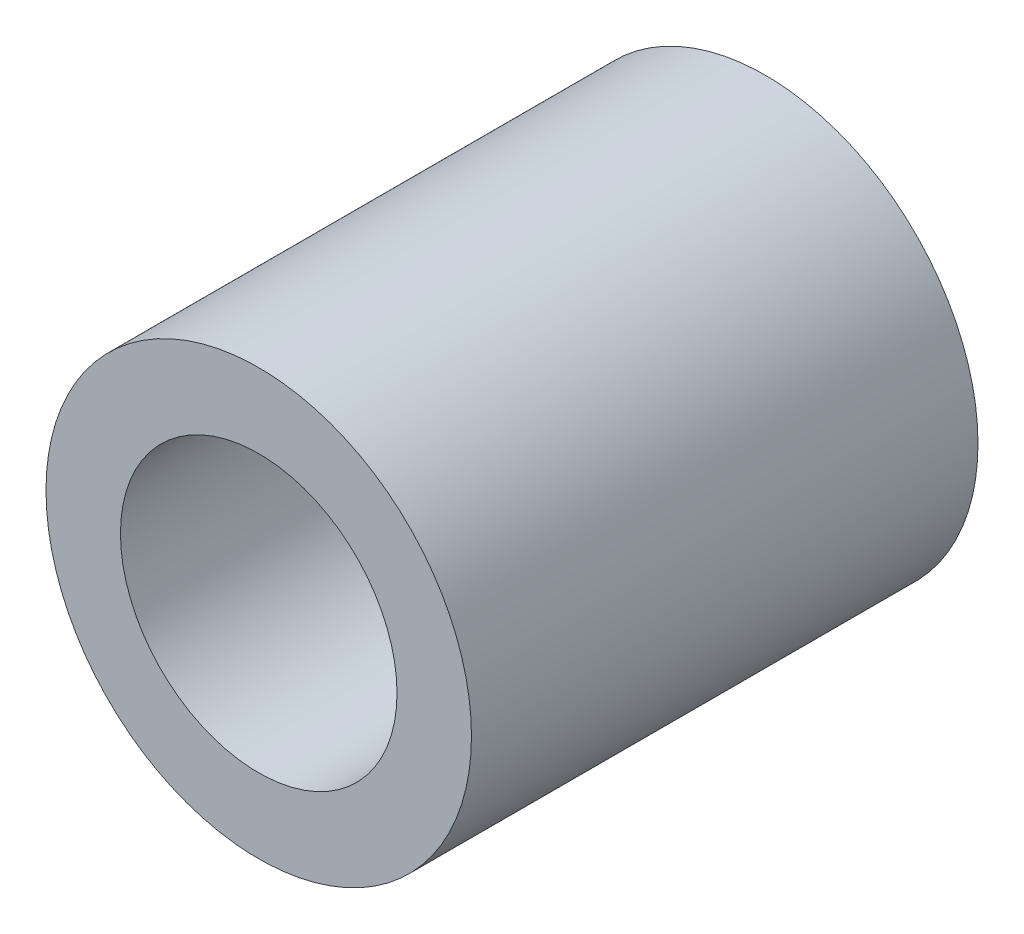
ISO-10303-21;
HEADER;
FILE_DESCRIPTION(('STEP AP214'),'2;1');
FILE_NAME('part.step','',(''),(''),'','','');
FILE_SCHEMA(('AUTOMOTIVE_DESIGN { 1 0 10303 214 1 1 1 1 }'));
ENDSEC;
DATA;
#1=APPLICATION_CONTEXT('core data for automotive mechanical design processes');
#2=APPLICATION_PROTOCOL_DEFINITION('international standard','automotive_design',2000,#1);
#3=PRODUCT_CONTEXT('',#1,'mechanical');
#4=PRODUCT('Part','Part','',(#3));
#5=PRODUCT_RELATED_PRODUCT_CATEGORY('part','',(#4));
#6=PRODUCT_DEFINITION_FORMATION('','',#4);
#7=PRODUCT_DEFINITION_CONTEXT('part definition',#1,'design');
#8=PRODUCT_DEFINITION('design','',#6,#7);
#9=PRODUCT_DEFINITION_SHAPE('','',#8);
#10=(LENGTH_UNIT() NAMED_UNIT(*) SI_UNIT(.MILLI.,.METRE.));
#11=(NAMED_UNIT(*) PLANE_ANGLE_UNIT() SI_UNIT($,.RADIAN.));
#12=(NAMED_UNIT(*) SI_UNIT($,.STERADIAN.) SOLID_ANGLE_UNIT());
#13=UNCERTAINTY_MEASURE_WITH_UNIT(LENGTH_MEASURE(1.E-05),#10,'distance_accuracy_value','');
#14=(GEOMETRIC_REPRESENTATION_CONTEXT(3) GLOBAL_UNCERTAINTY_ASSIGNED_CONTEXT((#13)) GLOBAL_UNIT_ASSIGNED_CONTEXT((#10,
#11,#12)) REPRESENTATION_CONTEXT('',''));
#15=CARTESIAN_POINT('',(0.,0.,0.));
#16=DIRECTION('',(0.,0.,1.));
#17=DIRECTION('',(1.,0.,0.));
#18=AXIS2_PLACEMENT_3D('',#15,#16,#17);
#19=CARTESIAN_POINT('',(0.,0.,25.4));
#20=DIRECTION('',(0.,0.,1.));
#21=DIRECTION('',(1.,0.,0.));
#22=AXIS2_PLACEMENT_3D('',#19,#20,#21);
#23=PLANE('',#22);
#24=CARTESIAN_POINT('',(0.,0.,25.4));
#25=DIRECTION('',(0.,0.,1.));
#26=DIRECTION('',(1.,0.,0.));
#27=AXIS2_PLACEMENT_3D('',#24,#25,#26);
#28=CIRCLE('',#27,10.668);
#29=CARTESIAN_POINT('',(10.668,0.,25.4));
#30=VERTEX_POINT('',#29);
#31=EDGE_CURVE('E10',#30,#30,#28,.T.);
#32=ORIENTED_EDGE('',*,*,#31,.T.);
#33=EDGE_LOOP('',(#32));
#34=FACE_BOUND('',#33,.T.);
#35=CARTESIAN_POINT('',(0.,0.,25.4));
#36=DIRECTION('',(0.,0.,1.));
#37=DIRECTION('',(1.,0.,0.));
#38=AXIS2_PLACEMENT_3D('',#35,#36,#37);
#39=CIRCLE('',#38,6.9342);
#40=CARTESIAN_POINT('',(6.9342,0.,25.4));
#41=VERTEX_POINT('',#40);
#42=EDGE_CURVE('E42',#41,#41,#39,.T.);
#43=ORIENTED_EDGE('',*,*,#42,.F.);
#44=EDGE_LOOP('',(#43));
#45=FACE_BOUND('',#44,.T.);
#46=ADVANCED_FACE('F31',(#34,#45),#23,.T.);
#47=CARTESIAN_POINT('',(0.,0.,0.));
#48=DIRECTION('',(0.,0.,1.));
#49=DIRECTION('',(1.,0.,0.));
#50=AXIS2_PLACEMENT_3D('',#47,#48,#49);
#51=PLANE('',#50);
#52=CARTESIAN_POINT('',(0.,0.,0.));
#53=DIRECTION('',(0.,0.,1.));
#54=DIRECTION('',(1.,0.,0.));
#55=AXIS2_PLACEMENT_3D('',#52,#53,#54);
#56=CIRCLE('',#55,10.668);
#57=CARTESIAN_POINT('',(10.668,0.,0.));
#58=VERTEX_POINT('',#57);
#59=EDGE_CURVE('E35',#58,#58,#56,.T.);
#60=ORIENTED_EDGE('',*,*,#59,.F.);
#61=EDGE_LOOP('',(#60));
#62=FACE_BOUND('',#61,.T.);
#63=CARTESIAN_POINT('',(0.,0.,0.));
#64=DIRECTION('',(0.,0.,1.));
#65=DIRECTION('',(1.,0.,0.));
#66=AXIS2_PLACEMENT_3D('',#63,#64,#65);
#67=CIRCLE('',#66,6.9342);
#68=CARTESIAN_POINT('',(6.9342,0.,0.));
#69=VERTEX_POINT('',#68);
#70=EDGE_CURVE('E44',#69,#69,#67,.T.);
#71=ORIENTED_EDGE('',*,*,#70,.T.);
#72=EDGE_LOOP('',(#71));
#73=FACE_BOUND('',#72,.T.);
#74=ADVANCED_FACE('F54',(#62,#73),#51,.F.);
#75=CARTESIAN_POINT('',(0.,0.,25.4));
#76=DIRECTION('',(0.,0.,-1.));
#77=DIRECTION('',(-1.,0.,0.));
#78=AXIS2_PLACEMENT_3D('',#75,#76,#77);
#79=CYLINDRICAL_SURFACE('',#78,10.668);
#80=ORIENTED_EDGE('',*,*,#31,.F.);
#81=EDGE_LOOP('',(#80));
#82=FACE_BOUND('',#81,.T.);
#83=ORIENTED_EDGE('',*,*,#59,.T.);
#84=EDGE_LOOP('',(#83));
#85=FACE_BOUND('',#84,.T.);
#86=ADVANCED_FACE('F33',(#82,#85),#79,.T.);
#87=CARTESIAN_POINT('',(0.,0.,25.4));
#88=DIRECTION('',(0.,0.,-1.));
#89=DIRECTION('',(-1.,0.,0.));
#90=AXIS2_PLACEMENT_3D('',#87,#88,#89);
#91=CYLINDRICAL_SURFACE('',#90,6.9342);
#92=ORIENTED_EDGE('',*,*,#42,.T.);
#93=EDGE_LOOP('',(#92));
#94=FACE_BOUND('',#93,.T.);
#95=ORIENTED_EDGE('',*,*,#70,.F.);
#96=EDGE_LOOP('',(#95));
#97=FACE_BOUND('',#96,.T.);
#98=ADVANCED_FACE('F50',(#94,#97),#91,.F.);
#99=CLOSED_SHELL('',(#46,#74,#86,#98));
#100=MANIFOLD_SOLID_BREP('B2',#99);
#101=ADVANCED_BREP_SHAPE_REPRESENTATION('',(#18,#100),#14);
#102=SHAPE_DEFINITION_REPRESENTATION(#9,#101);
ENDSEC;
END-ISO-10303-21;
